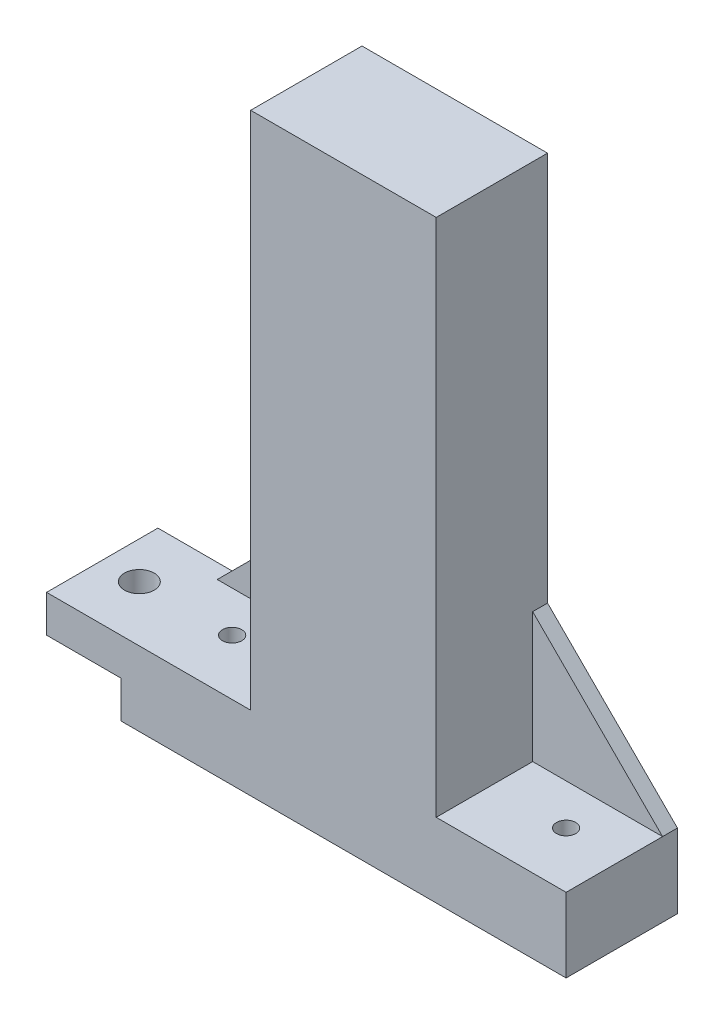
ISO-10303-21;
HEADER;
FILE_DESCRIPTION(('STEP AP214'),'2;1');
FILE_NAME('part.step','',(''),(''),'','','');
FILE_SCHEMA(('AUTOMOTIVE_DESIGN { 1 0 10303 214 1 1 1 1 }'));
ENDSEC;
DATA;
#1=APPLICATION_CONTEXT('core data for automotive mechanical design processes');
#2=APPLICATION_PROTOCOL_DEFINITION('international standard','automotive_design',2000,#1);
#3=PRODUCT_CONTEXT('',#1,'mechanical');
#4=PRODUCT('Part','Part','',(#3));
#5=PRODUCT_RELATED_PRODUCT_CATEGORY('part','',(#4));
#6=PRODUCT_DEFINITION_FORMATION('','',#4);
#7=PRODUCT_DEFINITION_CONTEXT('part definition',#1,'design');
#8=PRODUCT_DEFINITION('design','',#6,#7);
#9=PRODUCT_DEFINITION_SHAPE('','',#8);
#10=(LENGTH_UNIT() NAMED_UNIT(*) SI_UNIT(.MILLI.,.METRE.));
#11=(NAMED_UNIT(*) PLANE_ANGLE_UNIT() SI_UNIT($,.RADIAN.));
#12=(NAMED_UNIT(*) SI_UNIT($,.STERADIAN.) SOLID_ANGLE_UNIT());
#13=UNCERTAINTY_MEASURE_WITH_UNIT(LENGTH_MEASURE(1.E-05),#10,'distance_accuracy_value','');
#14=(GEOMETRIC_REPRESENTATION_CONTEXT(3) GLOBAL_UNCERTAINTY_ASSIGNED_CONTEXT((#13)) GLOBAL_UNIT_ASSIGNED_CONTEXT((#10,
#11,#12)) REPRESENTATION_CONTEXT('',''));
#15=CARTESIAN_POINT('',(0.,0.,0.));
#16=DIRECTION('',(0.,0.,1.));
#17=DIRECTION('',(1.,0.,0.));
#18=AXIS2_PLACEMENT_3D('',#15,#16,#17);
#19=CARTESIAN_POINT('',(-30.,10.,-7.5));
#20=DIRECTION('',(1.,0.,0.));
#21=DIRECTION('',(0.,0.,-1.));
#22=AXIS2_PLACEMENT_3D('',#19,#20,#21);
#23=PLANE('',#22);
#24=DIRECTION('',(0.,0.,1.));
#25=VECTOR('',#24,1.);
#26=CARTESIAN_POINT('',(-30.,5.,-18.6803398874989));
#27=LINE('',#26,#25);
#28=CARTESIAN_POINT('',(-30.,5.,-7.5));
#29=VERTEX_POINT('',#28);
#30=CARTESIAN_POINT('',(-30.,5.,7.5));
#31=VERTEX_POINT('',#30);
#32=EDGE_CURVE('E58',#29,#31,#27,.T.);
#33=ORIENTED_EDGE('',*,*,#32,.F.);
#34=DIRECTION('',(0.,-1.,0.));
#35=VECTOR('',#34,1.);
#36=CARTESIAN_POINT('',(-30.,10.,-7.5));
#37=LINE('',#36,#35);
#38=CARTESIAN_POINT('',(-30.,0.,-7.5));
#39=VERTEX_POINT('',#38);
#40=EDGE_CURVE('E51',#29,#39,#37,.T.);
#41=ORIENTED_EDGE('',*,*,#40,.T.);
#42=DIRECTION('',(0.,0.,1.));
#43=VECTOR('',#42,1.);
#44=CARTESIAN_POINT('',(-30.,0.,-7.5));
#45=LINE('',#44,#43);
#46=CARTESIAN_POINT('',(-30.,0.,7.5));
#47=VERTEX_POINT('',#46);
#48=EDGE_CURVE('E295',#39,#47,#45,.T.);
#49=ORIENTED_EDGE('',*,*,#48,.T.);
#50=DIRECTION('',(0.,-1.,0.));
#51=VECTOR('',#50,1.);
#52=CARTESIAN_POINT('',(-30.,10.,7.5));
#53=LINE('',#52,#51);
#54=EDGE_CURVE('E304',#31,#47,#53,.T.);
#55=ORIENTED_EDGE('',*,*,#54,.F.);
#56=EDGE_LOOP('',(#33,#41,#49,#55));
#57=FACE_BOUND('',#56,.T.);
#58=ADVANCED_FACE('F41',(#57),#23,.F.);
#59=CARTESIAN_POINT('',(0.,10.,0.));
#60=DIRECTION('',(0.,1.,0.));
#61=DIRECTION('',(0.,0.,1.));
#62=AXIS2_PLACEMENT_3D('',#59,#60,#61);
#63=PLANE('',#62);
#64=CARTESIAN_POINT('',(-35.,10.,0.));
#65=DIRECTION('',(0.,1.,0.));
#66=DIRECTION('',(0.,0.,1.));
#67=AXIS2_PLACEMENT_3D('',#64,#65,#66);
#68=CIRCLE('',#67,2.);
#69=CARTESIAN_POINT('',(-35.,10.,2.));
#70=VERTEX_POINT('',#69);
#71=EDGE_CURVE('E178',#70,#70,#68,.T.);
#72=ORIENTED_EDGE('',*,*,#71,.F.);
#73=EDGE_LOOP('',(#72));
#74=FACE_BOUND('',#73,.T.);
#75=CARTESIAN_POINT('',(-22.5,10.,0.));
#76=DIRECTION('',(0.,1.,0.));
#77=DIRECTION('',(0.,0.,1.));
#78=AXIS2_PLACEMENT_3D('',#75,#76,#77);
#79=CIRCLE('',#78,1.3);
#80=CARTESIAN_POINT('',(-22.5,10.,1.3));
#81=VERTEX_POINT('',#80);
#82=EDGE_CURVE('E272',#81,#81,#79,.T.);
#83=ORIENTED_EDGE('',*,*,#82,.F.);
#84=EDGE_LOOP('',(#83));
#85=FACE_BOUND('',#84,.T.);
#86=DIRECTION('',(0.,0.,1.));
#87=VECTOR('',#86,1.);
#88=CARTESIAN_POINT('',(-12.5,10.,-7.5));
#89=LINE('',#88,#87);
#90=CARTESIAN_POINT('',(-12.5,10.,-5.5));
#91=VERTEX_POINT('',#90);
#92=CARTESIAN_POINT('',(-12.5,10.,7.5));
#93=VERTEX_POINT('',#92);
#94=EDGE_CURVE('E236',#91,#93,#89,.T.);
#95=ORIENTED_EDGE('',*,*,#94,.F.);
#96=DIRECTION('',(-1.,0.,0.));
#97=VECTOR('',#96,1.);
#98=CARTESIAN_POINT('',(-12.5,10.,-5.5));
#99=LINE('',#98,#97);
#100=CARTESIAN_POINT('',(-30.,10.,-5.5));
#101=VERTEX_POINT('',#100);
#102=EDGE_CURVE('E66',#91,#101,#99,.T.);
#103=ORIENTED_EDGE('',*,*,#102,.T.);
#104=DIRECTION('',(0.,0.,1.));
#105=VECTOR('',#104,1.);
#106=CARTESIAN_POINT('',(-30.,10.,-7.5));
#107=LINE('',#106,#105);
#108=CARTESIAN_POINT('',(-30.,10.,-7.5));
#109=VERTEX_POINT('',#108);
#110=EDGE_CURVE('E284',#109,#101,#107,.T.);
#111=ORIENTED_EDGE('',*,*,#110,.F.);
#112=DIRECTION('',(1.,0.,0.));
#113=VECTOR('',#112,1.);
#114=CARTESIAN_POINT('',(-30.,10.,-7.5));
#115=LINE('',#114,#113);
#116=CARTESIAN_POINT('',(-40.,10.,-7.5));
#117=VERTEX_POINT('',#116);
#118=EDGE_CURVE('E163',#117,#109,#115,.T.);
#119=ORIENTED_EDGE('',*,*,#118,.F.);
#120=DIRECTION('',(0.,0.,1.));
#121=VECTOR('',#120,1.);
#122=CARTESIAN_POINT('',(-40.,10.,-18.6803398874989));
#123=LINE('',#122,#121);
#124=CARTESIAN_POINT('',(-40.,10.,7.5));
#125=VERTEX_POINT('',#124);
#126=EDGE_CURVE('E160',#117,#125,#123,.T.);
#127=ORIENTED_EDGE('',*,*,#126,.T.);
#128=DIRECTION('',(1.,0.,0.));
#129=VECTOR('',#128,1.);
#130=CARTESIAN_POINT('',(-30.,10.,7.5));
#131=LINE('',#130,#129);
#132=EDGE_CURVE('E144',#125,#93,#131,.T.);
#133=ORIENTED_EDGE('',*,*,#132,.T.);
#134=EDGE_LOOP('',(#95,#103,#111,#119,#127,#133));
#135=FACE_BOUND('',#134,.T.);
#136=ADVANCED_FACE('F161',(#74,#85,#135),#63,.T.);
#137=CARTESIAN_POINT('',(22.5,10.,0.));
#138=DIRECTION('',(0.,1.,0.));
#139=DIRECTION('',(0.,0.,-1.));
#140=AXIS2_PLACEMENT_3D('',#137,#138,#139);
#141=CIRCLE('',#140,1.3);
#142=CARTESIAN_POINT('',(22.5,10.,-1.3));
#143=VERTEX_POINT('',#142);
#144=EDGE_CURVE('E264',#143,#143,#141,.T.);
#145=ORIENTED_EDGE('',*,*,#144,.F.);
#146=EDGE_LOOP('',(#145));
#147=FACE_BOUND('',#146,.T.);
#148=DIRECTION('',(0.,0.,-1.));
#149=VECTOR('',#148,1.);
#150=CARTESIAN_POINT('',(30.,10.,-7.5));
#151=LINE('',#150,#149);
#152=CARTESIAN_POINT('',(30.,10.,7.5));
#153=VERTEX_POINT('',#152);
#154=CARTESIAN_POINT('',(30.,10.,-5.5));
#155=VERTEX_POINT('',#154);
#156=EDGE_CURVE('E280',#153,#155,#151,.T.);
#157=ORIENTED_EDGE('',*,*,#156,.T.);
#158=DIRECTION('',(-1.,0.,0.));
#159=VECTOR('',#158,1.);
#160=CARTESIAN_POINT('',(12.5,10.,-5.5));
#161=LINE('',#160,#159);
#162=CARTESIAN_POINT('',(12.5,10.,-5.5));
#163=VERTEX_POINT('',#162);
#164=EDGE_CURVE('E208',#155,#163,#161,.T.);
#165=ORIENTED_EDGE('',*,*,#164,.T.);
#166=DIRECTION('',(0.,0.,-1.));
#167=VECTOR('',#166,1.);
#168=CARTESIAN_POINT('',(12.5,10.,-7.5));
#169=LINE('',#168,#167);
#170=CARTESIAN_POINT('',(12.5,10.,7.5));
#171=VERTEX_POINT('',#170);
#172=EDGE_CURVE('E227',#171,#163,#169,.T.);
#173=ORIENTED_EDGE('',*,*,#172,.F.);
#174=EDGE_CURVE('E156',#171,#153,#131,.T.);
#175=ORIENTED_EDGE('',*,*,#174,.T.);
#176=EDGE_LOOP('',(#157,#165,#173,#175));
#177=FACE_BOUND('',#176,.T.);
#178=ADVANCED_FACE('F324',(#147,#177),#63,.T.);
#179=CARTESIAN_POINT('',(0.,0.,0.));
#180=DIRECTION('',(0.,1.,0.));
#181=DIRECTION('',(0.,0.,1.));
#182=AXIS2_PLACEMENT_3D('',#179,#180,#181);
#183=PLANE('',#182);
#184=DIRECTION('',(0.,0.,-1.));
#185=VECTOR('',#184,1.);
#186=CARTESIAN_POINT('',(30.,0.,-7.5));
#187=LINE('',#186,#185);
#188=CARTESIAN_POINT('',(30.,0.,7.5));
#189=VERTEX_POINT('',#188);
#190=CARTESIAN_POINT('',(30.,0.,-7.5));
#191=VERTEX_POINT('',#190);
#192=EDGE_CURVE('E276',#189,#191,#187,.T.);
#193=ORIENTED_EDGE('',*,*,#192,.F.);
#194=DIRECTION('',(1.,0.,0.));
#195=VECTOR('',#194,1.);
#196=CARTESIAN_POINT('',(-30.,0.,7.5));
#197=LINE('',#196,#195);
#198=EDGE_CURVE('E285',#47,#189,#197,.T.);
#199=ORIENTED_EDGE('',*,*,#198,.F.);
#200=ORIENTED_EDGE('',*,*,#48,.F.);
#201=DIRECTION('',(-1.,0.,0.));
#202=VECTOR('',#201,1.);
#203=CARTESIAN_POINT('',(-30.,0.,-7.5));
#204=LINE('',#203,#202);
#205=EDGE_CURVE('E291',#191,#39,#204,.T.);
#206=ORIENTED_EDGE('',*,*,#205,.F.);
#207=EDGE_LOOP('',(#193,#199,#200,#206));
#208=FACE_BOUND('',#207,.T.);
#209=CARTESIAN_POINT('',(-22.5,0.,0.));
#210=DIRECTION('',(0.,1.,0.));
#211=DIRECTION('',(0.,0.,1.));
#212=AXIS2_PLACEMENT_3D('',#209,#210,#211);
#213=CIRCLE('',#212,1.3);
#214=CARTESIAN_POINT('',(-22.5,0.,1.3));
#215=VERTEX_POINT('',#214);
#216=EDGE_CURVE('E268',#215,#215,#213,.T.);
#217=ORIENTED_EDGE('',*,*,#216,.T.);
#218=EDGE_LOOP('',(#217));
#219=FACE_BOUND('',#218,.T.);
#220=CARTESIAN_POINT('',(22.5,0.,0.));
#221=DIRECTION('',(0.,1.,0.));
#222=DIRECTION('',(0.,0.,-1.));
#223=AXIS2_PLACEMENT_3D('',#220,#221,#222);
#224=CIRCLE('',#223,1.3);
#225=CARTESIAN_POINT('',(22.5,0.,-1.3));
#226=VERTEX_POINT('',#225);
#227=EDGE_CURVE('E263',#226,#226,#224,.T.);
#228=ORIENTED_EDGE('',*,*,#227,.T.);
#229=EDGE_LOOP('',(#228));
#230=FACE_BOUND('',#229,.T.);
#231=ADVANCED_FACE('F316',(#208,#219,#230),#183,.F.);
#232=CARTESIAN_POINT('',(30.,10.,-7.5));
#233=DIRECTION('',(-1.,0.,0.));
#234=DIRECTION('',(0.,0.,1.));
#235=AXIS2_PLACEMENT_3D('',#232,#233,#234);
#236=PLANE('',#235);
#237=ORIENTED_EDGE('',*,*,#192,.T.);
#238=DIRECTION('',(0.,-1.,0.));
#239=VECTOR('',#238,1.);
#240=CARTESIAN_POINT('',(30.,10.,-7.5));
#241=LINE('',#240,#239);
#242=CARTESIAN_POINT('',(30.,10.,-7.5));
#243=VERTEX_POINT('',#242);
#244=EDGE_CURVE('E11',#243,#191,#241,.T.);
#245=ORIENTED_EDGE('',*,*,#244,.F.);
#246=DIRECTION('',(0.,0.,-1.));
#247=VECTOR('',#246,1.);
#248=CARTESIAN_POINT('',(30.,10.,-5.5));
#249=LINE('',#248,#247);
#250=EDGE_CURVE('E224',#155,#243,#249,.T.);
#251=ORIENTED_EDGE('',*,*,#250,.F.);
#252=ORIENTED_EDGE('',*,*,#156,.F.);
#253=DIRECTION('',(0.,-1.,0.));
#254=VECTOR('',#253,1.);
#255=CARTESIAN_POINT('',(30.,10.,7.5));
#256=LINE('',#255,#254);
#257=EDGE_CURVE('E155',#153,#189,#256,.T.);
#258=ORIENTED_EDGE('',*,*,#257,.T.);
#259=EDGE_LOOP('',(#237,#245,#251,#252,#258));
#260=FACE_BOUND('',#259,.T.);
#261=ADVANCED_FACE('F43',(#260),#236,.F.);
#262=CARTESIAN_POINT('',(-30.,10.,-7.5));
#263=DIRECTION('',(0.,0.,1.));
#264=DIRECTION('',(1.,0.,0.));
#265=AXIS2_PLACEMENT_3D('',#262,#263,#264);
#266=PLANE('',#265);
#267=ORIENTED_EDGE('',*,*,#40,.F.);
#268=DIRECTION('',(-1.,0.,0.));
#269=VECTOR('',#268,1.);
#270=CARTESIAN_POINT('',(-30.,5.,-7.5));
#271=LINE('',#270,#269);
#272=CARTESIAN_POINT('',(-40.,5.,-7.5));
#273=VERTEX_POINT('',#272);
#274=EDGE_CURVE('E180',#29,#273,#271,.T.);
#275=ORIENTED_EDGE('',*,*,#274,.T.);
#276=DIRECTION('',(0.,1.,0.));
#277=VECTOR('',#276,1.);
#278=CARTESIAN_POINT('',(-40.,10.,-7.5));
#279=LINE('',#278,#277);
#280=EDGE_CURVE('E185',#273,#117,#279,.T.);
#281=ORIENTED_EDGE('',*,*,#280,.T.);
#282=ORIENTED_EDGE('',*,*,#118,.T.);
#283=DIRECTION('',(0.707106781186551,0.707106781186544,0.));
#284=VECTOR('',#283,1.);
#285=CARTESIAN_POINT('',(-30.,10.,-7.5));
#286=LINE('',#285,#284);
#287=CARTESIAN_POINT('',(-12.5,27.4999999999998,-7.5));
#288=VERTEX_POINT('',#287);
#289=EDGE_CURVE('E190',#109,#288,#286,.T.);
#290=ORIENTED_EDGE('',*,*,#289,.T.);
#291=DIRECTION('',(0.,-1.,0.));
#292=VECTOR('',#291,1.);
#293=CARTESIAN_POINT('',(-12.5,80.,-7.5));
#294=LINE('',#293,#292);
#295=CARTESIAN_POINT('',(-12.5,80.,-7.5));
#296=VERTEX_POINT('',#295);
#297=EDGE_CURVE('E256',#296,#288,#294,.T.);
#298=ORIENTED_EDGE('',*,*,#297,.F.);
#299=DIRECTION('',(-1.,0.,0.));
#300=VECTOR('',#299,1.);
#301=CARTESIAN_POINT('',(-12.5,80.,-7.5));
#302=LINE('',#301,#300);
#303=CARTESIAN_POINT('',(12.5,80.,-7.5));
#304=VERTEX_POINT('',#303);
#305=EDGE_CURVE('E235',#304,#296,#302,.T.);
#306=ORIENTED_EDGE('',*,*,#305,.F.);
#307=DIRECTION('',(0.,-1.,0.));
#308=VECTOR('',#307,1.);
#309=CARTESIAN_POINT('',(12.5,80.,-7.5));
#310=LINE('',#309,#308);
#311=CARTESIAN_POINT('',(12.5,27.4999999999998,-7.5));
#312=VERTEX_POINT('',#311);
#313=EDGE_CURVE('E259',#304,#312,#310,.T.);
#314=ORIENTED_EDGE('',*,*,#313,.T.);
#315=DIRECTION('',(0.707106781186551,-0.707106781186544,0.));
#316=VECTOR('',#315,1.);
#317=CARTESIAN_POINT('',(30.,10.,-7.5));
#318=LINE('',#317,#316);
#319=EDGE_CURVE('E207',#312,#243,#318,.T.);
#320=ORIENTED_EDGE('',*,*,#319,.T.);
#321=ORIENTED_EDGE('',*,*,#244,.T.);
#322=ORIENTED_EDGE('',*,*,#205,.T.);
#323=EDGE_LOOP('',(#267,#275,#281,#282,#290,#298,#306,#314,#320,#321,#322));
#324=FACE_BOUND('',#323,.T.);
#325=ADVANCED_FACE('F312',(#324),#266,.F.);
#326=CARTESIAN_POINT('',(-30.,10.,7.5));
#327=DIRECTION('',(0.,0.,-1.));
#328=DIRECTION('',(-1.,0.,0.));
#329=AXIS2_PLACEMENT_3D('',#326,#327,#328);
#330=PLANE('',#329);
#331=ORIENTED_EDGE('',*,*,#198,.T.);
#332=ORIENTED_EDGE('',*,*,#257,.F.);
#333=ORIENTED_EDGE('',*,*,#174,.F.);
#334=DIRECTION('',(0.,-1.,0.));
#335=VECTOR('',#334,1.);
#336=CARTESIAN_POINT('',(12.5,80.,7.5));
#337=LINE('',#336,#335);
#338=CARTESIAN_POINT('',(12.5,80.,7.5));
#339=VERTEX_POINT('',#338);
#340=EDGE_CURVE('E245',#339,#171,#337,.T.);
#341=ORIENTED_EDGE('',*,*,#340,.F.);
#342=DIRECTION('',(1.,0.,0.));
#343=VECTOR('',#342,1.);
#344=CARTESIAN_POINT('',(-12.5,80.,7.5));
#345=LINE('',#344,#343);
#346=CARTESIAN_POINT('',(-12.5,80.,7.5));
#347=VERTEX_POINT('',#346);
#348=EDGE_CURVE('E242',#347,#339,#345,.T.);
#349=ORIENTED_EDGE('',*,*,#348,.F.);
#350=DIRECTION('',(0.,-1.,0.));
#351=VECTOR('',#350,1.);
#352=CARTESIAN_POINT('',(-12.5,80.,7.5));
#353=LINE('',#352,#351);
#354=EDGE_CURVE('E153',#347,#93,#353,.T.);
#355=ORIENTED_EDGE('',*,*,#354,.T.);
#356=ORIENTED_EDGE('',*,*,#132,.F.);
#357=DIRECTION('',(0.,-1.,0.));
#358=VECTOR('',#357,1.);
#359=CARTESIAN_POINT('',(-40.,10.,7.5));
#360=LINE('',#359,#358);
#361=CARTESIAN_POINT('',(-40.,5.,7.5));
#362=VERTEX_POINT('',#361);
#363=EDGE_CURVE('E149',#125,#362,#360,.T.);
#364=ORIENTED_EDGE('',*,*,#363,.T.);
#365=DIRECTION('',(1.,0.,0.));
#366=VECTOR('',#365,1.);
#367=CARTESIAN_POINT('',(-30.,5.,7.5));
#368=LINE('',#367,#366);
#369=EDGE_CURVE('E168',#362,#31,#368,.T.);
#370=ORIENTED_EDGE('',*,*,#369,.T.);
#371=ORIENTED_EDGE('',*,*,#54,.T.);
#372=EDGE_LOOP('',(#331,#332,#333,#341,#349,#355,#356,#364,#370,#371));
#373=FACE_BOUND('',#372,.T.);
#374=ADVANCED_FACE('F146',(#373),#330,.F.);
#375=CARTESIAN_POINT('',(-22.5,10.,0.));
#376=DIRECTION('',(0.,-1.,0.));
#377=DIRECTION('',(0.,0.,-1.));
#378=AXIS2_PLACEMENT_3D('',#375,#376,#377);
#379=CYLINDRICAL_SURFACE('',#378,1.3);
#380=ORIENTED_EDGE('',*,*,#82,.T.);
#381=EDGE_LOOP('',(#380));
#382=FACE_BOUND('',#381,.T.);
#383=ORIENTED_EDGE('',*,*,#216,.F.);
#384=EDGE_LOOP('',(#383));
#385=FACE_BOUND('',#384,.T.);
#386=ADVANCED_FACE('F341',(#382,#385),#379,.F.);
#387=CARTESIAN_POINT('',(22.5,10.,0.));
#388=DIRECTION('',(0.,-1.,0.));
#389=DIRECTION('',(0.,0.,-1.));
#390=AXIS2_PLACEMENT_3D('',#387,#388,#389);
#391=CYLINDRICAL_SURFACE('',#390,1.3);
#392=ORIENTED_EDGE('',*,*,#144,.T.);
#393=EDGE_LOOP('',(#392));
#394=FACE_BOUND('',#393,.T.);
#395=ORIENTED_EDGE('',*,*,#227,.F.);
#396=EDGE_LOOP('',(#395));
#397=FACE_BOUND('',#396,.T.);
#398=ADVANCED_FACE('F344',(#394,#397),#391,.F.);
#399=CARTESIAN_POINT('',(12.5,80.,-7.5));
#400=DIRECTION('',(-1.,0.,0.));
#401=DIRECTION('',(0.,0.,1.));
#402=AXIS2_PLACEMENT_3D('',#399,#400,#401);
#403=PLANE('',#402);
#404=DIRECTION('',(0.,1.,0.));
#405=VECTOR('',#404,1.);
#406=CARTESIAN_POINT('',(12.5,27.4999999999998,-5.5));
#407=LINE('',#406,#405);
#408=CARTESIAN_POINT('',(12.5,27.4999999999998,-5.5));
#409=VERTEX_POINT('',#408);
#410=EDGE_CURVE('E212',#163,#409,#407,.T.);
#411=ORIENTED_EDGE('',*,*,#410,.T.);
#412=DIRECTION('',(0.,0.,-1.));
#413=VECTOR('',#412,1.);
#414=CARTESIAN_POINT('',(12.5,27.4999999999998,-5.5));
#415=LINE('',#414,#413);
#416=EDGE_CURVE('E220',#409,#312,#415,.T.);
#417=ORIENTED_EDGE('',*,*,#416,.T.);
#418=ORIENTED_EDGE('',*,*,#313,.F.);
#419=DIRECTION('',(0.,0.,-1.));
#420=VECTOR('',#419,1.);
#421=CARTESIAN_POINT('',(12.5,80.,-7.5));
#422=LINE('',#421,#420);
#423=EDGE_CURVE('E231',#339,#304,#422,.T.);
#424=ORIENTED_EDGE('',*,*,#423,.F.);
#425=ORIENTED_EDGE('',*,*,#340,.T.);
#426=ORIENTED_EDGE('',*,*,#172,.T.);
#427=EDGE_LOOP('',(#411,#417,#418,#424,#425,#426));
#428=FACE_BOUND('',#427,.T.);
#429=ADVANCED_FACE('F353',(#428),#403,.F.);
#430=CARTESIAN_POINT('',(-12.5,80.,-7.5));
#431=DIRECTION('',(1.,0.,0.));
#432=DIRECTION('',(0.,0.,-1.));
#433=AXIS2_PLACEMENT_3D('',#430,#431,#432);
#434=PLANE('',#433);
#435=ORIENTED_EDGE('',*,*,#297,.T.);
#436=DIRECTION('',(0.,0.,-1.));
#437=VECTOR('',#436,1.);
#438=CARTESIAN_POINT('',(-12.5,27.4999999999998,-5.5));
#439=LINE('',#438,#437);
#440=CARTESIAN_POINT('',(-12.5,27.4999999999998,-5.5));
#441=VERTEX_POINT('',#440);
#442=EDGE_CURVE('E200',#441,#288,#439,.T.);
#443=ORIENTED_EDGE('',*,*,#442,.F.);
#444=DIRECTION('',(0.,-1.,0.));
#445=VECTOR('',#444,1.);
#446=CARTESIAN_POINT('',(-12.5,27.4999999999998,-5.5));
#447=LINE('',#446,#445);
#448=EDGE_CURVE('E195',#441,#91,#447,.T.);
#449=ORIENTED_EDGE('',*,*,#448,.T.);
#450=ORIENTED_EDGE('',*,*,#94,.T.);
#451=ORIENTED_EDGE('',*,*,#354,.F.);
#452=DIRECTION('',(0.,0.,1.));
#453=VECTOR('',#452,1.);
#454=CARTESIAN_POINT('',(-12.5,80.,-7.5));
#455=LINE('',#454,#453);
#456=EDGE_CURVE('E239',#296,#347,#455,.T.);
#457=ORIENTED_EDGE('',*,*,#456,.F.);
#458=EDGE_LOOP('',(#435,#443,#449,#450,#451,#457));
#459=FACE_BOUND('',#458,.T.);
#460=ADVANCED_FACE('F359',(#459),#434,.F.);
#461=CARTESIAN_POINT('',(0.,80.,0.));
#462=DIRECTION('',(0.,1.,0.));
#463=DIRECTION('',(0.,0.,1.));
#464=AXIS2_PLACEMENT_3D('',#461,#462,#463);
#465=PLANE('',#464);
#466=ORIENTED_EDGE('',*,*,#423,.T.);
#467=ORIENTED_EDGE('',*,*,#305,.T.);
#468=ORIENTED_EDGE('',*,*,#456,.T.);
#469=ORIENTED_EDGE('',*,*,#348,.T.);
#470=EDGE_LOOP('',(#466,#467,#468,#469));
#471=FACE_BOUND('',#470,.T.);
#472=ADVANCED_FACE('F441',(#471),#465,.T.);
#473=CARTESIAN_POINT('',(30.,10.,-5.5));
#474=DIRECTION('',(0.707106781186544,0.707106781186551,0.));
#475=DIRECTION('',(-0.707106781186551,0.707106781186544,0.));
#476=AXIS2_PLACEMENT_3D('',#473,#474,#475);
#477=PLANE('',#476);
#478=ORIENTED_EDGE('',*,*,#319,.F.);
#479=ORIENTED_EDGE('',*,*,#416,.F.);
#480=DIRECTION('',(0.707106781186551,-0.707106781186544,0.));
#481=VECTOR('',#480,1.);
#482=CARTESIAN_POINT('',(30.,10.,-5.5));
#483=LINE('',#482,#481);
#484=EDGE_CURVE('E216',#409,#155,#483,.T.);
#485=ORIENTED_EDGE('',*,*,#484,.T.);
#486=ORIENTED_EDGE('',*,*,#250,.T.);
#487=EDGE_LOOP('',(#478,#479,#485,#486));
#488=FACE_BOUND('',#487,.T.);
#489=ADVANCED_FACE('F437',(#488),#477,.T.);
#490=CARTESIAN_POINT('',(0.,0.,-5.5));
#491=DIRECTION('',(0.,0.,-1.));
#492=DIRECTION('',(-1.,0.,0.));
#493=AXIS2_PLACEMENT_3D('',#490,#491,#492);
#494=PLANE('',#493);
#495=ORIENTED_EDGE('',*,*,#164,.F.);
#496=ORIENTED_EDGE('',*,*,#484,.F.);
#497=ORIENTED_EDGE('',*,*,#410,.F.);
#498=EDGE_LOOP('',(#495,#496,#497));
#499=FACE_BOUND('',#498,.T.);
#500=ADVANCED_FACE('F433',(#499),#494,.F.);
#501=CARTESIAN_POINT('',(-30.,10.,-5.5));
#502=DIRECTION('',(-0.707106781186544,0.707106781186551,0.));
#503=DIRECTION('',(-0.707106781186551,-0.707106781186544,0.));
#504=AXIS2_PLACEMENT_3D('',#501,#502,#503);
#505=PLANE('',#504);
#506=ORIENTED_EDGE('',*,*,#289,.F.);
#507=ORIENTED_EDGE('',*,*,#110,.T.);
#508=DIRECTION('',(0.707106781186551,0.707106781186544,0.));
#509=VECTOR('',#508,1.);
#510=CARTESIAN_POINT('',(-30.,10.,-5.5));
#511=LINE('',#510,#509);
#512=EDGE_CURVE('E191',#101,#441,#511,.T.);
#513=ORIENTED_EDGE('',*,*,#512,.T.);
#514=ORIENTED_EDGE('',*,*,#442,.T.);
#515=EDGE_LOOP('',(#506,#507,#513,#514));
#516=FACE_BOUND('',#515,.T.);
#517=ADVANCED_FACE('F429',(#516),#505,.T.);
#518=CARTESIAN_POINT('',(0.,0.,-5.5));
#519=DIRECTION('',(0.,0.,-1.));
#520=DIRECTION('',(-1.,0.,0.));
#521=AXIS2_PLACEMENT_3D('',#518,#519,#520);
#522=PLANE('',#521);
#523=ORIENTED_EDGE('',*,*,#512,.F.);
#524=ORIENTED_EDGE('',*,*,#102,.F.);
#525=ORIENTED_EDGE('',*,*,#448,.F.);
#526=EDGE_LOOP('',(#523,#524,#525));
#527=FACE_BOUND('',#526,.T.);
#528=ADVANCED_FACE('F409',(#527),#522,.F.);
#529=CARTESIAN_POINT('',(-30.,5.,-18.6803398874989));
#530=DIRECTION('',(0.,-1.,0.));
#531=DIRECTION('',(1.,0.,0.));
#532=AXIS2_PLACEMENT_3D('',#529,#530,#531);
#533=PLANE('',#532);
#534=CARTESIAN_POINT('',(-35.,5.,0.));
#535=DIRECTION('',(0.,-1.,0.));
#536=DIRECTION('',(1.,0.,0.));
#537=AXIS2_PLACEMENT_3D('',#534,#535,#536);
#538=CIRCLE('',#537,2.);
#539=CARTESIAN_POINT('',(-33.,5.,0.));
#540=VERTEX_POINT('',#539);
#541=EDGE_CURVE('E45',#540,#540,#538,.T.);
#542=ORIENTED_EDGE('',*,*,#541,.F.);
#543=EDGE_LOOP('',(#542));
#544=FACE_BOUND('',#543,.T.);
#545=ORIENTED_EDGE('',*,*,#274,.F.);
#546=ORIENTED_EDGE('',*,*,#32,.T.);
#547=ORIENTED_EDGE('',*,*,#369,.F.);
#548=DIRECTION('',(0.,0.,1.));
#549=VECTOR('',#548,1.);
#550=CARTESIAN_POINT('',(-40.,5.,-18.6803398874989));
#551=LINE('',#550,#549);
#552=EDGE_CURVE('E167',#273,#362,#551,.T.);
#553=ORIENTED_EDGE('',*,*,#552,.F.);
#554=EDGE_LOOP('',(#545,#546,#547,#553));
#555=FACE_BOUND('',#554,.T.);
#556=ADVANCED_FACE('F404',(#544,#555),#533,.T.);
#557=CARTESIAN_POINT('',(-40.,10.,-18.6803398874989));
#558=DIRECTION('',(-1.,0.,0.));
#559=DIRECTION('',(0.,0.,1.));
#560=AXIS2_PLACEMENT_3D('',#557,#558,#559);
#561=PLANE('',#560);
#562=ORIENTED_EDGE('',*,*,#280,.F.);
#563=ORIENTED_EDGE('',*,*,#552,.T.);
#564=ORIENTED_EDGE('',*,*,#363,.F.);
#565=ORIENTED_EDGE('',*,*,#126,.F.);
#566=EDGE_LOOP('',(#562,#563,#564,#565));
#567=FACE_BOUND('',#566,.T.);
#568=ADVANCED_FACE('F170',(#567),#561,.T.);
#569=CARTESIAN_POINT('',(-35.,0.,0.));
#570=DIRECTION('',(0.,1.,0.));
#571=DIRECTION('',(0.,0.,1.));
#572=AXIS2_PLACEMENT_3D('',#569,#570,#571);
#573=CYLINDRICAL_SURFACE('',#572,2.);
#574=ORIENTED_EDGE('',*,*,#541,.T.);
#575=EDGE_LOOP('',(#574));
#576=FACE_BOUND('',#575,.T.);
#577=ORIENTED_EDGE('',*,*,#71,.T.);
#578=EDGE_LOOP('',(#577));
#579=FACE_BOUND('',#578,.T.);
#580=ADVANCED_FACE('F334',(#576,#579),#573,.F.);
#581=CLOSED_SHELL('',(#58,#136,#178,#231,#261,#325,#374,#386,#398,#429,#460,#472,#489,#500,#517,
#528,#556,#568,#580));
#582=MANIFOLD_SOLID_BREP('B2',#581);
#583=ADVANCED_BREP_SHAPE_REPRESENTATION('',(#18,#582),#14);
#584=SHAPE_DEFINITION_REPRESENTATION(#9,#583);
ENDSEC;
END-ISO-10303-21;
